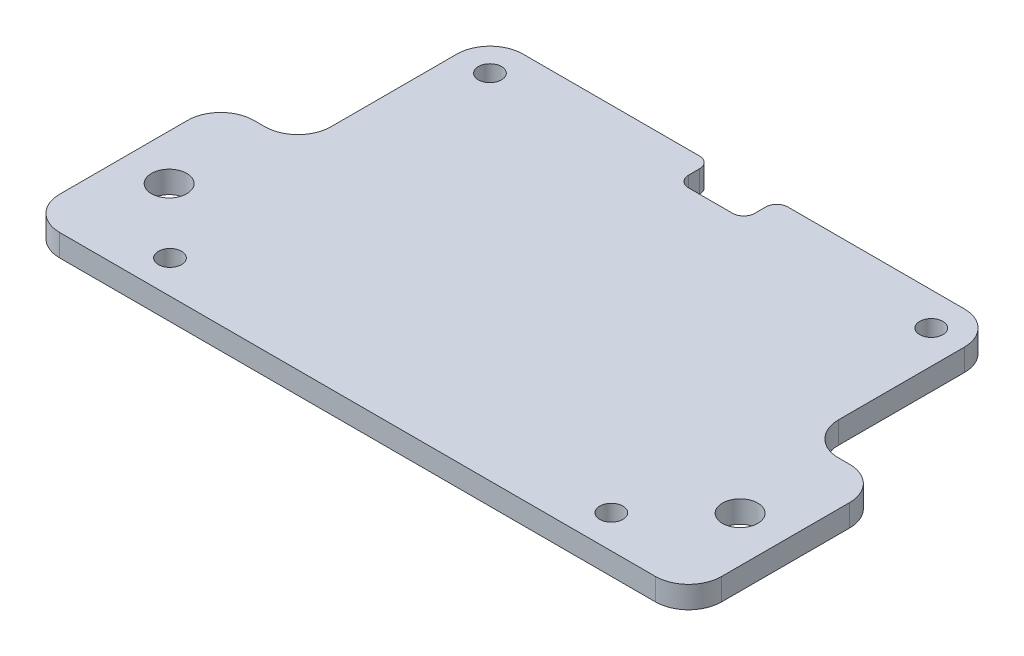
ISO-10303-21;
HEADER;
FILE_DESCRIPTION(('STEP AP214'),'2;1');
FILE_NAME('part.step','',(''),(''),'','','');
FILE_SCHEMA(('AUTOMOTIVE_DESIGN { 1 0 10303 214 1 1 1 1 }'));
ENDSEC;
DATA;
#1=APPLICATION_CONTEXT('core data for automotive mechanical design processes');
#2=APPLICATION_PROTOCOL_DEFINITION('international standard','automotive_design',2000,#1);
#3=PRODUCT_CONTEXT('',#1,'mechanical');
#4=PRODUCT('Part','Part','',(#3));
#5=PRODUCT_RELATED_PRODUCT_CATEGORY('part','',(#4));
#6=PRODUCT_DEFINITION_FORMATION('','',#4);
#7=PRODUCT_DEFINITION_CONTEXT('part definition',#1,'design');
#8=PRODUCT_DEFINITION('design','',#6,#7);
#9=PRODUCT_DEFINITION_SHAPE('','',#8);
#10=(LENGTH_UNIT() NAMED_UNIT(*) SI_UNIT(.MILLI.,.METRE.));
#11=(NAMED_UNIT(*) PLANE_ANGLE_UNIT() SI_UNIT($,.RADIAN.));
#12=(NAMED_UNIT(*) SI_UNIT($,.STERADIAN.) SOLID_ANGLE_UNIT());
#13=UNCERTAINTY_MEASURE_WITH_UNIT(LENGTH_MEASURE(1.E-05),#10,'distance_accuracy_value','');
#14=(GEOMETRIC_REPRESENTATION_CONTEXT(3) GLOBAL_UNCERTAINTY_ASSIGNED_CONTEXT((#13)) GLOBAL_UNIT_ASSIGNED_CONTEXT((#10,
#11,#12)) REPRESENTATION_CONTEXT('',''));
#15=CARTESIAN_POINT('',(0.,0.,0.));
#16=DIRECTION('',(0.,0.,1.));
#17=DIRECTION('',(1.,0.,0.));
#18=AXIS2_PLACEMENT_3D('',#15,#16,#17);
#19=CARTESIAN_POINT('',(-7.06061640884124,2.,-17.5));
#20=DIRECTION('',(0.,1.,0.));
#21=DIRECTION('',(0.,0.,1.));
#22=AXIS2_PLACEMENT_3D('',#19,#20,#21);
#23=PLANE('',#22);
#24=CARTESIAN_POINT('',(-50.0606164088412,2.,-14.5));
#25=DIRECTION('',(0.,1.,0.));
#26=DIRECTION('',(0.,0.,1.));
#27=AXIS2_PLACEMENT_3D('',#24,#25,#26);
#28=CIRCLE('',#27,1.05);
#29=CARTESIAN_POINT('',(-50.0606164088412,2.,-13.45));
#30=VERTEX_POINT('',#29);
#31=EDGE_CURVE('E518',#30,#30,#28,.T.);
#32=ORIENTED_EDGE('',*,*,#31,.F.);
#33=EDGE_LOOP('',(#32));
#34=FACE_BOUND('',#33,.T.);
#35=CARTESIAN_POINT('',(-55.9356164088412,2.,8.69999999999997));
#36=DIRECTION('',(0.,1.,0.));
#37=DIRECTION('',(0.,0.,1.));
#38=AXIS2_PLACEMENT_3D('',#35,#36,#37);
#39=CIRCLE('',#38,1.6);
#40=CARTESIAN_POINT('',(-55.9356164088412,2.,10.3));
#41=VERTEX_POINT('',#40);
#42=EDGE_CURVE('E506',#41,#41,#39,.T.);
#43=ORIENTED_EDGE('',*,*,#42,.F.);
#44=EDGE_LOOP('',(#43));
#45=FACE_BOUND('',#44,.T.);
#46=CARTESIAN_POINT('',(-10.0606164088412,2.,14.5));
#47=DIRECTION('',(0.,1.,0.));
#48=DIRECTION('',(0.,0.,1.));
#49=AXIS2_PLACEMENT_3D('',#46,#47,#48);
#50=CIRCLE('',#49,1.05);
#51=CARTESIAN_POINT('',(-10.0606164088412,2.,15.55));
#52=VERTEX_POINT('',#51);
#53=EDGE_CURVE('E376',#52,#52,#50,.T.);
#54=ORIENTED_EDGE('',*,*,#53,.F.);
#55=EDGE_LOOP('',(#54));
#56=FACE_BOUND('',#55,.T.);
#57=DIRECTION('',(0.,0.,-1.));
#58=VECTOR('',#57,1.);
#59=CARTESIAN_POINT('',(-33.0606164088412,2.,-14.5));
#60=LINE('',#59,#58);
#61=CARTESIAN_POINT('',(-33.0606164088412,2.,-15.5));
#62=VERTEX_POINT('',#61);
#63=CARTESIAN_POINT('',(-33.0606164088412,2.,-16.5));
#64=VERTEX_POINT('',#63);
#65=EDGE_CURVE('E347',#62,#64,#60,.T.);
#66=ORIENTED_EDGE('',*,*,#65,.T.);
#67=CARTESIAN_POINT('',(-34.0606164088412,2.,-16.5));
#68=DIRECTION('',(0.,1.,0.));
#69=DIRECTION('',(0.,0.,1.));
#70=AXIS2_PLACEMENT_3D('',#67,#68,#69);
#71=CIRCLE('',#70,1.);
#72=CARTESIAN_POINT('',(-34.0606164088412,2.,-17.5));
#73=VERTEX_POINT('',#72);
#74=EDGE_CURVE('E313',#64,#73,#71,.T.);
#75=ORIENTED_EDGE('',*,*,#74,.T.);
#76=DIRECTION('',(-1.,0.,0.));
#77=VECTOR('',#76,1.);
#78=CARTESIAN_POINT('',(-53.0606164088412,2.,-17.5));
#79=LINE('',#78,#77);
#80=CARTESIAN_POINT('',(-50.0606164088412,2.,-17.5));
#81=VERTEX_POINT('',#80);
#82=EDGE_CURVE('E351',#73,#81,#79,.T.);
#83=ORIENTED_EDGE('',*,*,#82,.T.);
#84=CARTESIAN_POINT('',(-50.0606164088412,2.,-14.5));
#85=DIRECTION('',(0.,1.,0.));
#86=DIRECTION('',(0.,0.,1.));
#87=AXIS2_PLACEMENT_3D('',#84,#85,#86);
#88=CIRCLE('',#87,3.);
#89=CARTESIAN_POINT('',(-53.0606164088412,2.,-14.5));
#90=VERTEX_POINT('',#89);
#91=EDGE_CURVE('E252',#81,#90,#88,.T.);
#92=ORIENTED_EDGE('',*,*,#91,.T.);
#93=DIRECTION('',(0.,0.,1.));
#94=VECTOR('',#93,1.);
#95=CARTESIAN_POINT('',(-53.0606164088412,2.,-0.100000000000037));
#96=LINE('',#95,#94);
#97=CARTESIAN_POINT('',(-53.0606164088412,2.,-3.10000000000004));
#98=VERTEX_POINT('',#97);
#99=EDGE_CURVE('E357',#90,#98,#96,.T.);
#100=ORIENTED_EDGE('',*,*,#99,.T.);
#101=CARTESIAN_POINT('',(-56.0606164088412,2.,-3.10000000000004));
#102=DIRECTION('',(0.,1.,0.));
#103=DIRECTION('',(0.,0.,1.));
#104=AXIS2_PLACEMENT_3D('',#101,#102,#103);
#105=CIRCLE('',#104,3.);
#106=CARTESIAN_POINT('',(-56.0606164088412,2.,-0.100000000000035));
#107=VERTEX_POINT('',#106);
#108=EDGE_CURVE('E293',#98,#107,#105,.F.);
#109=ORIENTED_EDGE('',*,*,#108,.T.);
#110=DIRECTION('',(-1.,0.,0.));
#111=VECTOR('',#110,1.);
#112=CARTESIAN_POINT('',(-53.0606164088412,2.,-0.100000000000037));
#113=LINE('',#112,#111);
#114=CARTESIAN_POINT('',(-57.0606164088412,2.,-0.100000000000034));
#115=VERTEX_POINT('',#114);
#116=EDGE_CURVE('E360',#107,#115,#113,.T.);
#117=ORIENTED_EDGE('',*,*,#116,.T.);
#118=CARTESIAN_POINT('',(-57.0606164088412,2.,2.89999999999997));
#119=DIRECTION('',(0.,1.,0.));
#120=DIRECTION('',(0.,0.,1.));
#121=AXIS2_PLACEMENT_3D('',#118,#119,#120);
#122=CIRCLE('',#121,3.);
#123=CARTESIAN_POINT('',(-60.0606164088412,2.,2.89999999999997));
#124=VERTEX_POINT('',#123);
#125=EDGE_CURVE('E250',#115,#124,#122,.T.);
#126=ORIENTED_EDGE('',*,*,#125,.T.);
#127=DIRECTION('',(0.,0.,1.));
#128=VECTOR('',#127,1.);
#129=CARTESIAN_POINT('',(-60.0606164088412,2.,17.5));
#130=LINE('',#129,#128);
#131=CARTESIAN_POINT('',(-60.0606164088412,2.,14.5));
#132=VERTEX_POINT('',#131);
#133=EDGE_CURVE('E363',#124,#132,#130,.T.);
#134=ORIENTED_EDGE('',*,*,#133,.T.);
#135=CARTESIAN_POINT('',(-57.0606164088412,2.,14.5));
#136=DIRECTION('',(0.,1.,0.));
#137=DIRECTION('',(0.,0.,1.));
#138=AXIS2_PLACEMENT_3D('',#135,#136,#137);
#139=CIRCLE('',#138,3.);
#140=CARTESIAN_POINT('',(-57.0606164088412,2.,17.5));
#141=VERTEX_POINT('',#140);
#142=EDGE_CURVE('E248',#132,#141,#139,.T.);
#143=ORIENTED_EDGE('',*,*,#142,.T.);
#144=DIRECTION('',(1.,0.,0.));
#145=VECTOR('',#144,1.);
#146=CARTESIAN_POINT('',(-30.0606164088412,2.,17.5));
#147=LINE('',#146,#145);
#148=CARTESIAN_POINT('',(-3.06061640884124,2.,17.5));
#149=VERTEX_POINT('',#148);
#150=EDGE_CURVE('E366',#141,#149,#147,.T.);
#151=ORIENTED_EDGE('',*,*,#150,.T.);
#152=CARTESIAN_POINT('',(-3.06061640884124,2.,14.5));
#153=DIRECTION('',(0.,1.,0.));
#154=DIRECTION('',(0.,0.,1.));
#155=AXIS2_PLACEMENT_3D('',#152,#153,#154);
#156=CIRCLE('',#155,3.);
#157=CARTESIAN_POINT('',(-0.0606164088412381,2.,14.5));
#158=VERTEX_POINT('',#157);
#159=EDGE_CURVE('E258',#149,#158,#156,.T.);
#160=ORIENTED_EDGE('',*,*,#159,.T.);
#161=DIRECTION('',(0.,0.,-1.));
#162=VECTOR('',#161,1.);
#163=CARTESIAN_POINT('',(-0.0606164088412381,2.,17.5));
#164=LINE('',#163,#162);
#165=CARTESIAN_POINT('',(-0.0606164088412381,2.,2.89999999999997));
#166=VERTEX_POINT('',#165);
#167=EDGE_CURVE('E213',#158,#166,#164,.T.);
#168=ORIENTED_EDGE('',*,*,#167,.T.);
#169=CARTESIAN_POINT('',(-3.06061640884124,2.,2.89999999999996));
#170=DIRECTION('',(0.,1.,0.));
#171=DIRECTION('',(0.,0.,1.));
#172=AXIS2_PLACEMENT_3D('',#169,#170,#171);
#173=CIRCLE('',#172,3.);
#174=CARTESIAN_POINT('',(-3.06061640884124,2.,-0.100000000000035));
#175=VERTEX_POINT('',#174);
#176=EDGE_CURVE('E256',#166,#175,#173,.T.);
#177=ORIENTED_EDGE('',*,*,#176,.T.);
#178=DIRECTION('',(-1.,0.,0.));
#179=VECTOR('',#178,1.);
#180=CARTESIAN_POINT('',(-7.06061640884124,2.,-0.100000000000037));
#181=LINE('',#180,#179);
#182=CARTESIAN_POINT('',(-4.06061640884124,2.,-0.100000000000036));
#183=VERTEX_POINT('',#182);
#184=EDGE_CURVE('E370',#175,#183,#181,.T.);
#185=ORIENTED_EDGE('',*,*,#184,.T.);
#186=CARTESIAN_POINT('',(-4.06061640884124,2.,-3.10000000000004));
#187=DIRECTION('',(0.,1.,0.));
#188=DIRECTION('',(0.,0.,1.));
#189=AXIS2_PLACEMENT_3D('',#186,#187,#188);
#190=CIRCLE('',#189,3.);
#191=CARTESIAN_POINT('',(-7.06061640884124,2.,-3.10000000000004));
#192=VERTEX_POINT('',#191);
#193=EDGE_CURVE('E297',#183,#192,#190,.F.);
#194=ORIENTED_EDGE('',*,*,#193,.T.);
#195=DIRECTION('',(0.,0.,-1.));
#196=VECTOR('',#195,1.);
#197=CARTESIAN_POINT('',(-7.06061640884124,2.,-0.100000000000037));
#198=LINE('',#197,#196);
#199=CARTESIAN_POINT('',(-7.06061640884124,2.,-14.5));
#200=VERTEX_POINT('',#199);
#201=EDGE_CURVE('E234',#192,#200,#198,.T.);
#202=ORIENTED_EDGE('',*,*,#201,.T.);
#203=CARTESIAN_POINT('',(-10.0606164088412,2.,-14.5));
#204=DIRECTION('',(0.,1.,0.));
#205=DIRECTION('',(0.,0.,1.));
#206=AXIS2_PLACEMENT_3D('',#203,#204,#205);
#207=CIRCLE('',#206,3.);
#208=CARTESIAN_POINT('',(-10.0606164088412,2.,-17.5));
#209=VERTEX_POINT('',#208);
#210=EDGE_CURVE('E254',#200,#209,#207,.T.);
#211=ORIENTED_EDGE('',*,*,#210,.T.);
#212=DIRECTION('',(-1.,0.,0.));
#213=VECTOR('',#212,1.);
#214=CARTESIAN_POINT('',(-27.0606164088412,2.,-17.5));
#215=LINE('',#214,#213);
#216=CARTESIAN_POINT('',(-26.0606164088412,2.,-17.5));
#217=VERTEX_POINT('',#216);
#218=EDGE_CURVE('E233',#209,#217,#215,.T.);
#219=ORIENTED_EDGE('',*,*,#218,.T.);
#220=CARTESIAN_POINT('',(-26.0606164088412,2.,-16.5));
#221=DIRECTION('',(0.,1.,0.));
#222=DIRECTION('',(0.,0.,1.));
#223=AXIS2_PLACEMENT_3D('',#220,#221,#222);
#224=CIRCLE('',#223,1.);
#225=CARTESIAN_POINT('',(-27.0606164088412,2.,-16.5));
#226=VERTEX_POINT('',#225);
#227=EDGE_CURVE('E311',#217,#226,#224,.T.);
#228=ORIENTED_EDGE('',*,*,#227,.T.);
#229=DIRECTION('',(0.,0.,1.));
#230=VECTOR('',#229,1.);
#231=CARTESIAN_POINT('',(-27.0606164088412,2.,-17.5));
#232=LINE('',#231,#230);
#233=CARTESIAN_POINT('',(-27.0606164088412,2.,-15.5));
#234=VERTEX_POINT('',#233);
#235=EDGE_CURVE('E348',#226,#234,#232,.T.);
#236=ORIENTED_EDGE('',*,*,#235,.T.);
#237=CARTESIAN_POINT('',(-28.0606164088412,2.,-15.5));
#238=DIRECTION('',(0.,1.,0.));
#239=DIRECTION('',(0.,0.,1.));
#240=AXIS2_PLACEMENT_3D('',#237,#238,#239);
#241=CIRCLE('',#240,1.);
#242=CARTESIAN_POINT('',(-28.0606164088412,2.,-14.5));
#243=VERTEX_POINT('',#242);
#244=EDGE_CURVE('E11',#234,#243,#241,.F.);
#245=ORIENTED_EDGE('',*,*,#244,.T.);
#246=DIRECTION('',(-1.,0.,0.));
#247=VECTOR('',#246,1.);
#248=CARTESIAN_POINT('',(-27.0606164088412,2.,-14.5));
#249=LINE('',#248,#247);
#250=CARTESIAN_POINT('',(-32.0606164088412,2.,-14.5));
#251=VERTEX_POINT('',#250);
#252=EDGE_CURVE('E345',#243,#251,#249,.T.);
#253=ORIENTED_EDGE('',*,*,#252,.T.);
#254=CARTESIAN_POINT('',(-32.0606164088412,2.,-15.5));
#255=DIRECTION('',(0.,1.,0.));
#256=DIRECTION('',(0.,0.,1.));
#257=AXIS2_PLACEMENT_3D('',#254,#255,#256);
#258=CIRCLE('',#257,1.);
#259=EDGE_CURVE('E328',#251,#62,#258,.F.);
#260=ORIENTED_EDGE('',*,*,#259,.T.);
#261=EDGE_LOOP('',(#66,#75,#83,#92,#100,#109,#117,#126,#134,#143,#151,#160,#168,#177,#185,#194,
#202,#211,#219,#228,#236,#245,#253,#260));
#262=FACE_BOUND('',#261,.T.);
#263=CARTESIAN_POINT('',(-4.18561640884124,2.,8.69999999999997));
#264=DIRECTION('',(0.,1.,0.));
#265=DIRECTION('',(0.,0.,1.));
#266=AXIS2_PLACEMENT_3D('',#263,#264,#265);
#267=CIRCLE('',#266,1.6);
#268=CARTESIAN_POINT('',(-4.18561640884124,2.,10.3));
#269=VERTEX_POINT('',#268);
#270=EDGE_CURVE('E500',#269,#269,#267,.T.);
#271=ORIENTED_EDGE('',*,*,#270,.F.);
#272=EDGE_LOOP('',(#271));
#273=FACE_BOUND('',#272,.T.);
#274=CARTESIAN_POINT('',(-50.0606164088412,2.,14.5));
#275=DIRECTION('',(0.,1.,0.));
#276=DIRECTION('',(0.,0.,1.));
#277=AXIS2_PLACEMENT_3D('',#274,#275,#276);
#278=CIRCLE('',#277,1.05);
#279=CARTESIAN_POINT('',(-50.0606164088412,2.,15.55));
#280=VERTEX_POINT('',#279);
#281=EDGE_CURVE('E512',#280,#280,#278,.T.);
#282=ORIENTED_EDGE('',*,*,#281,.F.);
#283=EDGE_LOOP('',(#282));
#284=FACE_BOUND('',#283,.T.);
#285=CARTESIAN_POINT('',(-10.0606164088412,2.,-14.5));
#286=DIRECTION('',(0.,1.,0.));
#287=DIRECTION('',(0.,0.,1.));
#288=AXIS2_PLACEMENT_3D('',#285,#286,#287);
#289=CIRCLE('',#288,1.05);
#290=CARTESIAN_POINT('',(-10.0606164088412,2.,-13.45));
#291=VERTEX_POINT('',#290);
#292=EDGE_CURVE('E524',#291,#291,#289,.T.);
#293=ORIENTED_EDGE('',*,*,#292,.F.);
#294=EDGE_LOOP('',(#293));
#295=FACE_BOUND('',#294,.T.);
#296=ADVANCED_FACE('F32',(#34,#45,#56,#262,#273,#284,#295),#23,.T.);
#297=CARTESIAN_POINT('',(-7.06061640884124,0.,-17.5));
#298=DIRECTION('',(0.,1.,0.));
#299=DIRECTION('',(0.,0.,1.));
#300=AXIS2_PLACEMENT_3D('',#297,#298,#299);
#301=PLANE('',#300);
#302=CARTESIAN_POINT('',(-50.0606164088412,0.,-14.5));
#303=DIRECTION('',(0.,1.,0.));
#304=DIRECTION('',(0.,0.,1.));
#305=AXIS2_PLACEMENT_3D('',#302,#303,#304);
#306=CIRCLE('',#305,1.05);
#307=CARTESIAN_POINT('',(-50.0606164088412,0.,-13.45));
#308=VERTEX_POINT('',#307);
#309=EDGE_CURVE('E521',#308,#308,#306,.T.);
#310=ORIENTED_EDGE('',*,*,#309,.T.);
#311=EDGE_LOOP('',(#310));
#312=FACE_BOUND('',#311,.T.);
#313=CARTESIAN_POINT('',(-55.9356164088412,0.,8.69999999999997));
#314=DIRECTION('',(0.,1.,0.));
#315=DIRECTION('',(0.,0.,1.));
#316=AXIS2_PLACEMENT_3D('',#313,#314,#315);
#317=CIRCLE('',#316,1.6);
#318=CARTESIAN_POINT('',(-55.9356164088412,0.,10.3));
#319=VERTEX_POINT('',#318);
#320=EDGE_CURVE('E509',#319,#319,#317,.T.);
#321=ORIENTED_EDGE('',*,*,#320,.T.);
#322=EDGE_LOOP('',(#321));
#323=FACE_BOUND('',#322,.T.);
#324=CARTESIAN_POINT('',(-10.0606164088412,0.,14.5));
#325=DIRECTION('',(0.,1.,0.));
#326=DIRECTION('',(0.,0.,1.));
#327=AXIS2_PLACEMENT_3D('',#324,#325,#326);
#328=CIRCLE('',#327,1.05);
#329=CARTESIAN_POINT('',(-10.0606164088412,0.,15.55));
#330=VERTEX_POINT('',#329);
#331=EDGE_CURVE('E497',#330,#330,#328,.T.);
#332=ORIENTED_EDGE('',*,*,#331,.T.);
#333=EDGE_LOOP('',(#332));
#334=FACE_BOUND('',#333,.T.);
#335=DIRECTION('',(-1.,0.,0.));
#336=VECTOR('',#335,1.);
#337=CARTESIAN_POINT('',(-53.0606164088412,0.,-17.5));
#338=LINE('',#337,#336);
#339=CARTESIAN_POINT('',(-34.0606164088412,0.,-17.5));
#340=VERTEX_POINT('',#339);
#341=CARTESIAN_POINT('',(-50.0606164088412,0.,-17.5));
#342=VERTEX_POINT('',#341);
#343=EDGE_CURVE('E382',#340,#342,#338,.T.);
#344=ORIENTED_EDGE('',*,*,#343,.F.);
#345=CARTESIAN_POINT('',(-34.0606164088412,0.,-16.5));
#346=DIRECTION('',(0.,1.,0.));
#347=DIRECTION('',(0.,0.,1.));
#348=AXIS2_PLACEMENT_3D('',#345,#346,#347);
#349=CIRCLE('',#348,1.);
#350=CARTESIAN_POINT('',(-33.0606164088412,0.,-16.5));
#351=VERTEX_POINT('',#350);
#352=EDGE_CURVE('E304',#340,#351,#349,.F.);
#353=ORIENTED_EDGE('',*,*,#352,.T.);
#354=DIRECTION('',(0.,0.,-1.));
#355=VECTOR('',#354,1.);
#356=CARTESIAN_POINT('',(-33.0606164088412,0.,-14.5));
#357=LINE('',#356,#355);
#358=CARTESIAN_POINT('',(-33.0606164088412,0.,-15.5));
#359=VERTEX_POINT('',#358);
#360=EDGE_CURVE('E379',#359,#351,#357,.T.);
#361=ORIENTED_EDGE('',*,*,#360,.F.);
#362=CARTESIAN_POINT('',(-32.0606164088412,0.,-15.5));
#363=DIRECTION('',(0.,1.,0.));
#364=DIRECTION('',(0.,0.,1.));
#365=AXIS2_PLACEMENT_3D('',#362,#363,#364);
#366=CIRCLE('',#365,1.);
#367=CARTESIAN_POINT('',(-32.0606164088412,0.,-14.5));
#368=VERTEX_POINT('',#367);
#369=EDGE_CURVE('E326',#359,#368,#366,.T.);
#370=ORIENTED_EDGE('',*,*,#369,.T.);
#371=DIRECTION('',(-1.,0.,0.));
#372=VECTOR('',#371,1.);
#373=CARTESIAN_POINT('',(-27.0606164088412,0.,-14.5));
#374=LINE('',#373,#372);
#375=CARTESIAN_POINT('',(-28.0606164088412,0.,-14.5));
#376=VERTEX_POINT('',#375);
#377=EDGE_CURVE('E333',#376,#368,#374,.T.);
#378=ORIENTED_EDGE('',*,*,#377,.F.);
#379=CARTESIAN_POINT('',(-28.0606164088412,0.,-15.5));
#380=DIRECTION('',(0.,1.,0.));
#381=DIRECTION('',(0.,0.,1.));
#382=AXIS2_PLACEMENT_3D('',#379,#380,#381);
#383=CIRCLE('',#382,1.);
#384=CARTESIAN_POINT('',(-27.0606164088412,0.,-15.5));
#385=VERTEX_POINT('',#384);
#386=EDGE_CURVE('E40',#376,#385,#383,.T.);
#387=ORIENTED_EDGE('',*,*,#386,.T.);
#388=DIRECTION('',(0.,0.,1.));
#389=VECTOR('',#388,1.);
#390=CARTESIAN_POINT('',(-27.0606164088412,0.,-17.5));
#391=LINE('',#390,#389);
#392=CARTESIAN_POINT('',(-27.0606164088412,0.,-16.5));
#393=VERTEX_POINT('',#392);
#394=EDGE_CURVE('E332',#393,#385,#391,.T.);
#395=ORIENTED_EDGE('',*,*,#394,.F.);
#396=CARTESIAN_POINT('',(-26.0606164088412,0.,-16.5));
#397=DIRECTION('',(0.,1.,0.));
#398=DIRECTION('',(0.,0.,1.));
#399=AXIS2_PLACEMENT_3D('',#396,#397,#398);
#400=CIRCLE('',#399,1.);
#401=CARTESIAN_POINT('',(-26.0606164088412,0.,-17.5));
#402=VERTEX_POINT('',#401);
#403=EDGE_CURVE('E302',#393,#402,#400,.F.);
#404=ORIENTED_EDGE('',*,*,#403,.T.);
#405=DIRECTION('',(-1.,0.,0.));
#406=VECTOR('',#405,1.);
#407=CARTESIAN_POINT('',(-27.0606164088412,0.,-17.5));
#408=LINE('',#407,#406);
#409=CARTESIAN_POINT('',(-10.0606164088412,0.,-17.5));
#410=VERTEX_POINT('',#409);
#411=EDGE_CURVE('E341',#410,#402,#408,.T.);
#412=ORIENTED_EDGE('',*,*,#411,.F.);
#413=CARTESIAN_POINT('',(-10.0606164088412,0.,-14.5));
#414=DIRECTION('',(0.,1.,0.));
#415=DIRECTION('',(0.,0.,1.));
#416=AXIS2_PLACEMENT_3D('',#413,#414,#415);
#417=CIRCLE('',#416,3.);
#418=CARTESIAN_POINT('',(-7.06061640884124,0.,-14.5));
#419=VERTEX_POINT('',#418);
#420=EDGE_CURVE('E242',#410,#419,#417,.F.);
#421=ORIENTED_EDGE('',*,*,#420,.T.);
#422=DIRECTION('',(0.,0.,-1.));
#423=VECTOR('',#422,1.);
#424=CARTESIAN_POINT('',(-7.06061640884124,0.,-0.100000000000037));
#425=LINE('',#424,#423);
#426=CARTESIAN_POINT('',(-7.06061640884124,0.,-3.10000000000004));
#427=VERTEX_POINT('',#426);
#428=EDGE_CURVE('E225',#427,#419,#425,.T.);
#429=ORIENTED_EDGE('',*,*,#428,.F.);
#430=CARTESIAN_POINT('',(-4.06061640884124,0.,-3.10000000000004));
#431=DIRECTION('',(0.,1.,0.));
#432=DIRECTION('',(0.,0.,1.));
#433=AXIS2_PLACEMENT_3D('',#430,#431,#432);
#434=CIRCLE('',#433,3.);
#435=CARTESIAN_POINT('',(-4.06061640884124,0.,-0.100000000000036));
#436=VERTEX_POINT('',#435);
#437=EDGE_CURVE('E295',#427,#436,#434,.T.);
#438=ORIENTED_EDGE('',*,*,#437,.T.);
#439=DIRECTION('',(-1.,0.,0.));
#440=VECTOR('',#439,1.);
#441=CARTESIAN_POINT('',(-7.06061640884124,0.,-0.100000000000037));
#442=LINE('',#441,#440);
#443=CARTESIAN_POINT('',(-3.06061640884124,0.,-0.100000000000035));
#444=VERTEX_POINT('',#443);
#445=EDGE_CURVE('E221',#444,#436,#442,.T.);
#446=ORIENTED_EDGE('',*,*,#445,.F.);
#447=CARTESIAN_POINT('',(-3.06061640884124,0.,2.89999999999996));
#448=DIRECTION('',(0.,1.,0.));
#449=DIRECTION('',(0.,0.,1.));
#450=AXIS2_PLACEMENT_3D('',#447,#448,#449);
#451=CIRCLE('',#450,3.);
#452=CARTESIAN_POINT('',(-0.0606164088412381,0.,2.89999999999997));
#453=VERTEX_POINT('',#452);
#454=EDGE_CURVE('E204',#444,#453,#451,.F.);
#455=ORIENTED_EDGE('',*,*,#454,.T.);
#456=DIRECTION('',(0.,0.,-1.));
#457=VECTOR('',#456,1.);
#458=CARTESIAN_POINT('',(-0.0606164088412381,0.,17.5));
#459=LINE('',#458,#457);
#460=CARTESIAN_POINT('',(-0.0606164088412381,0.,14.5));
#461=VERTEX_POINT('',#460);
#462=EDGE_CURVE('E210',#461,#453,#459,.T.);
#463=ORIENTED_EDGE('',*,*,#462,.F.);
#464=CARTESIAN_POINT('',(-3.06061640884124,0.,14.5));
#465=DIRECTION('',(0.,1.,0.));
#466=DIRECTION('',(0.,0.,1.));
#467=AXIS2_PLACEMENT_3D('',#464,#465,#466);
#468=CIRCLE('',#467,3.);
#469=CARTESIAN_POINT('',(-3.06061640884124,0.,17.5));
#470=VERTEX_POINT('',#469);
#471=EDGE_CURVE('E193',#461,#470,#468,.F.);
#472=ORIENTED_EDGE('',*,*,#471,.T.);
#473=DIRECTION('',(1.,0.,0.));
#474=VECTOR('',#473,1.);
#475=CARTESIAN_POINT('',(-0.0606164088412381,0.,17.5));
#476=LINE('',#475,#474);
#477=CARTESIAN_POINT('',(-57.0606164088412,0.,17.5));
#478=VERTEX_POINT('',#477);
#479=EDGE_CURVE('E222',#478,#470,#476,.T.);
#480=ORIENTED_EDGE('',*,*,#479,.F.);
#481=CARTESIAN_POINT('',(-57.0606164088412,0.,14.5));
#482=DIRECTION('',(0.,1.,0.));
#483=DIRECTION('',(0.,0.,1.));
#484=AXIS2_PLACEMENT_3D('',#481,#482,#483);
#485=CIRCLE('',#484,3.);
#486=CARTESIAN_POINT('',(-60.0606164088412,0.,14.5));
#487=VERTEX_POINT('',#486);
#488=EDGE_CURVE('E214',#478,#487,#485,.F.);
#489=ORIENTED_EDGE('',*,*,#488,.T.);
#490=DIRECTION('',(0.,0.,1.));
#491=VECTOR('',#490,1.);
#492=CARTESIAN_POINT('',(-60.0606164088412,0.,17.5));
#493=LINE('',#492,#491);
#494=CARTESIAN_POINT('',(-60.0606164088412,0.,2.89999999999997));
#495=VERTEX_POINT('',#494);
#496=EDGE_CURVE('E227',#495,#487,#493,.T.);
#497=ORIENTED_EDGE('',*,*,#496,.F.);
#498=CARTESIAN_POINT('',(-57.0606164088412,0.,2.89999999999997));
#499=DIRECTION('',(0.,1.,0.));
#500=DIRECTION('',(0.,0.,1.));
#501=AXIS2_PLACEMENT_3D('',#498,#499,#500);
#502=CIRCLE('',#501,3.);
#503=CARTESIAN_POINT('',(-57.0606164088412,0.,-0.100000000000034));
#504=VERTEX_POINT('',#503);
#505=EDGE_CURVE('E237',#495,#504,#502,.F.);
#506=ORIENTED_EDGE('',*,*,#505,.T.);
#507=DIRECTION('',(-1.,0.,0.));
#508=VECTOR('',#507,1.);
#509=CARTESIAN_POINT('',(-53.0606164088412,0.,-0.100000000000037));
#510=LINE('',#509,#508);
#511=CARTESIAN_POINT('',(-56.0606164088412,0.,-0.100000000000035));
#512=VERTEX_POINT('',#511);
#513=EDGE_CURVE('E387',#512,#504,#510,.T.);
#514=ORIENTED_EDGE('',*,*,#513,.F.);
#515=CARTESIAN_POINT('',(-56.0606164088412,0.,-3.10000000000004));
#516=DIRECTION('',(0.,1.,0.));
#517=DIRECTION('',(0.,0.,1.));
#518=AXIS2_PLACEMENT_3D('',#515,#516,#517);
#519=CIRCLE('',#518,3.);
#520=CARTESIAN_POINT('',(-53.0606164088412,0.,-3.10000000000004));
#521=VERTEX_POINT('',#520);
#522=EDGE_CURVE('E291',#512,#521,#519,.T.);
#523=ORIENTED_EDGE('',*,*,#522,.T.);
#524=DIRECTION('',(0.,0.,1.));
#525=VECTOR('',#524,1.);
#526=CARTESIAN_POINT('',(-53.0606164088412,0.,-0.100000000000037));
#527=LINE('',#526,#525);
#528=CARTESIAN_POINT('',(-53.0606164088412,0.,-14.5));
#529=VERTEX_POINT('',#528);
#530=EDGE_CURVE('E384',#529,#521,#527,.T.);
#531=ORIENTED_EDGE('',*,*,#530,.F.);
#532=CARTESIAN_POINT('',(-50.0606164088412,0.,-14.5));
#533=DIRECTION('',(0.,1.,0.));
#534=DIRECTION('',(0.,0.,1.));
#535=AXIS2_PLACEMENT_3D('',#532,#533,#534);
#536=CIRCLE('',#535,3.);
#537=EDGE_CURVE('E239',#529,#342,#536,.F.);
#538=ORIENTED_EDGE('',*,*,#537,.T.);
#539=EDGE_LOOP('',(#344,#353,#361,#370,#378,#387,#395,#404,#412,#421,#429,#438,#446,#455,#463,
#472,#480,#489,#497,#506,#514,#523,#531,#538));
#540=FACE_BOUND('',#539,.T.);
#541=CARTESIAN_POINT('',(-4.18561640884124,0.,8.69999999999997));
#542=DIRECTION('',(0.,1.,0.));
#543=DIRECTION('',(0.,0.,1.));
#544=AXIS2_PLACEMENT_3D('',#541,#542,#543);
#545=CIRCLE('',#544,1.6);
#546=CARTESIAN_POINT('',(-4.18561640884124,0.,10.3));
#547=VERTEX_POINT('',#546);
#548=EDGE_CURVE('E503',#547,#547,#545,.T.);
#549=ORIENTED_EDGE('',*,*,#548,.T.);
#550=EDGE_LOOP('',(#549));
#551=FACE_BOUND('',#550,.T.);
#552=CARTESIAN_POINT('',(-50.0606164088412,0.,14.5));
#553=DIRECTION('',(0.,1.,0.));
#554=DIRECTION('',(0.,0.,1.));
#555=AXIS2_PLACEMENT_3D('',#552,#553,#554);
#556=CIRCLE('',#555,1.05);
#557=CARTESIAN_POINT('',(-50.0606164088412,0.,15.55));
#558=VERTEX_POINT('',#557);
#559=EDGE_CURVE('E515',#558,#558,#556,.T.);
#560=ORIENTED_EDGE('',*,*,#559,.T.);
#561=EDGE_LOOP('',(#560));
#562=FACE_BOUND('',#561,.T.);
#563=CARTESIAN_POINT('',(-10.0606164088412,0.,-14.5));
#564=DIRECTION('',(0.,1.,0.));
#565=DIRECTION('',(0.,0.,1.));
#566=AXIS2_PLACEMENT_3D('',#563,#564,#565);
#567=CIRCLE('',#566,1.05);
#568=CARTESIAN_POINT('',(-10.0606164088412,0.,-13.45));
#569=VERTEX_POINT('',#568);
#570=EDGE_CURVE('E527',#569,#569,#567,.T.);
#571=ORIENTED_EDGE('',*,*,#570,.T.);
#572=EDGE_LOOP('',(#571));
#573=FACE_BOUND('',#572,.T.);
#574=ADVANCED_FACE('F218',(#312,#323,#334,#540,#551,#562,#573),#301,.F.);
#575=CARTESIAN_POINT('',(-27.0606164088412,2.,-17.5));
#576=DIRECTION('',(0.,0.,1.));
#577=DIRECTION('',(1.,0.,0.));
#578=AXIS2_PLACEMENT_3D('',#575,#576,#577);
#579=PLANE('',#578);
#580=ORIENTED_EDGE('',*,*,#411,.T.);
#581=DIRECTION('',(0.,-1.,0.));
#582=VECTOR('',#581,1.);
#583=CARTESIAN_POINT('',(-26.0606164088412,2.,-17.5));
#584=LINE('',#583,#582);
#585=EDGE_CURVE('E324',#402,#217,#584,.F.);
#586=ORIENTED_EDGE('',*,*,#585,.T.);
#587=ORIENTED_EDGE('',*,*,#218,.F.);
#588=DIRECTION('',(0.,-1.,0.));
#589=VECTOR('',#588,1.);
#590=CARTESIAN_POINT('',(-10.0606164088412,2.,-17.5));
#591=LINE('',#590,#589);
#592=EDGE_CURVE('E280',#209,#410,#591,.T.);
#593=ORIENTED_EDGE('',*,*,#592,.T.);
#594=EDGE_LOOP('',(#580,#586,#587,#593));
#595=FACE_BOUND('',#594,.T.);
#596=ADVANCED_FACE('F420',(#595),#579,.F.);
#597=CARTESIAN_POINT('',(-27.0606164088412,2.,-17.5));
#598=DIRECTION('',(1.,0.,0.));
#599=DIRECTION('',(0.,0.,-1.));
#600=AXIS2_PLACEMENT_3D('',#597,#598,#599);
#601=PLANE('',#600);
#602=ORIENTED_EDGE('',*,*,#394,.T.);
#603=DIRECTION('',(0.,-1.,0.));
#604=VECTOR('',#603,1.);
#605=CARTESIAN_POINT('',(-27.0606164088412,2.,-15.5));
#606=LINE('',#605,#604);
#607=EDGE_CURVE('E322',#385,#234,#606,.F.);
#608=ORIENTED_EDGE('',*,*,#607,.T.);
#609=ORIENTED_EDGE('',*,*,#235,.F.);
#610=DIRECTION('',(0.,-1.,0.));
#611=VECTOR('',#610,1.);
#612=CARTESIAN_POINT('',(-27.0606164088412,2.,-16.5));
#613=LINE('',#612,#611);
#614=EDGE_CURVE('E319',#226,#393,#613,.T.);
#615=ORIENTED_EDGE('',*,*,#614,.T.);
#616=EDGE_LOOP('',(#602,#608,#609,#615));
#617=FACE_BOUND('',#616,.T.);
#618=ADVANCED_FACE('F338',(#617),#601,.F.);
#619=CARTESIAN_POINT('',(-27.0606164088412,2.,-14.5));
#620=DIRECTION('',(0.,0.,1.));
#621=DIRECTION('',(1.,0.,0.));
#622=AXIS2_PLACEMENT_3D('',#619,#620,#621);
#623=PLANE('',#622);
#624=ORIENTED_EDGE('',*,*,#377,.T.);
#625=DIRECTION('',(0.,-1.,0.));
#626=VECTOR('',#625,1.);
#627=CARTESIAN_POINT('',(-32.0606164088412,2.,-14.5));
#628=LINE('',#627,#626);
#629=EDGE_CURVE('E47',#368,#251,#628,.F.);
#630=ORIENTED_EDGE('',*,*,#629,.T.);
#631=ORIENTED_EDGE('',*,*,#252,.F.);
#632=DIRECTION('',(0.,-1.,0.));
#633=VECTOR('',#632,1.);
#634=CARTESIAN_POINT('',(-28.0606164088412,0.,-14.5));
#635=LINE('',#634,#633);
#636=EDGE_CURVE('E315',#243,#376,#635,.T.);
#637=ORIENTED_EDGE('',*,*,#636,.T.);
#638=EDGE_LOOP('',(#624,#630,#631,#637));
#639=FACE_BOUND('',#638,.T.);
#640=ADVANCED_FACE('F344',(#639),#623,.F.);
#641=CARTESIAN_POINT('',(-33.0606164088412,2.,-14.5));
#642=DIRECTION('',(-1.,0.,0.));
#643=DIRECTION('',(0.,0.,1.));
#644=AXIS2_PLACEMENT_3D('',#641,#642,#643);
#645=PLANE('',#644);
#646=ORIENTED_EDGE('',*,*,#360,.T.);
#647=DIRECTION('',(0.,-1.,0.));
#648=VECTOR('',#647,1.);
#649=CARTESIAN_POINT('',(-33.0606164088412,2.,-16.5));
#650=LINE('',#649,#648);
#651=EDGE_CURVE('E309',#351,#64,#650,.F.);
#652=ORIENTED_EDGE('',*,*,#651,.T.);
#653=ORIENTED_EDGE('',*,*,#65,.F.);
#654=DIRECTION('',(0.,-1.,0.));
#655=VECTOR('',#654,1.);
#656=CARTESIAN_POINT('',(-33.0606164088412,0.,-15.5));
#657=LINE('',#656,#655);
#658=EDGE_CURVE('E306',#62,#359,#657,.T.);
#659=ORIENTED_EDGE('',*,*,#658,.T.);
#660=EDGE_LOOP('',(#646,#652,#653,#659));
#661=FACE_BOUND('',#660,.T.);
#662=ADVANCED_FACE('F664',(#661),#645,.F.);
#663=CARTESIAN_POINT('',(-53.0606164088412,2.,-17.5));
#664=DIRECTION('',(0.,0.,1.));
#665=DIRECTION('',(1.,0.,0.));
#666=AXIS2_PLACEMENT_3D('',#663,#664,#665);
#667=PLANE('',#666);
#668=ORIENTED_EDGE('',*,*,#82,.F.);
#669=DIRECTION('',(0.,-1.,0.));
#670=VECTOR('',#669,1.);
#671=CARTESIAN_POINT('',(-34.0606164088412,2.,-17.5));
#672=LINE('',#671,#670);
#673=EDGE_CURVE('E299',#73,#340,#672,.T.);
#674=ORIENTED_EDGE('',*,*,#673,.T.);
#675=ORIENTED_EDGE('',*,*,#343,.T.);
#676=DIRECTION('',(0.,-1.,0.));
#677=VECTOR('',#676,1.);
#678=CARTESIAN_POINT('',(-50.0606164088412,2.,-17.5));
#679=LINE('',#678,#677);
#680=EDGE_CURVE('E283',#342,#81,#679,.F.);
#681=ORIENTED_EDGE('',*,*,#680,.T.);
#682=EDGE_LOOP('',(#668,#674,#675,#681));
#683=FACE_BOUND('',#682,.T.);
#684=ADVANCED_FACE('F673',(#683),#667,.F.);
#685=CARTESIAN_POINT('',(-53.0606164088412,2.,-0.100000000000037));
#686=DIRECTION('',(1.,0.,0.));
#687=DIRECTION('',(0.,0.,-1.));
#688=AXIS2_PLACEMENT_3D('',#685,#686,#687);
#689=PLANE('',#688);
#690=ORIENTED_EDGE('',*,*,#530,.T.);
#691=DIRECTION('',(0.,-1.,0.));
#692=VECTOR('',#691,1.);
#693=CARTESIAN_POINT('',(-53.0606164088412,2.,-3.10000000000004));
#694=LINE('',#693,#692);
#695=EDGE_CURVE('E273',#521,#98,#694,.F.);
#696=ORIENTED_EDGE('',*,*,#695,.T.);
#697=ORIENTED_EDGE('',*,*,#99,.F.);
#698=DIRECTION('',(0.,-1.,0.));
#699=VECTOR('',#698,1.);
#700=CARTESIAN_POINT('',(-53.0606164088412,2.,-14.5));
#701=LINE('',#700,#699);
#702=EDGE_CURVE('E270',#90,#529,#701,.T.);
#703=ORIENTED_EDGE('',*,*,#702,.T.);
#704=EDGE_LOOP('',(#690,#696,#697,#703));
#705=FACE_BOUND('',#704,.T.);
#706=ADVANCED_FACE('F683',(#705),#689,.F.);
#707=CARTESIAN_POINT('',(-53.0606164088412,2.,-0.100000000000037));
#708=DIRECTION('',(0.,0.,1.));
#709=DIRECTION('',(1.,0.,0.));
#710=AXIS2_PLACEMENT_3D('',#707,#708,#709);
#711=PLANE('',#710);
#712=ORIENTED_EDGE('',*,*,#116,.F.);
#713=DIRECTION('',(0.,-1.,0.));
#714=VECTOR('',#713,1.);
#715=CARTESIAN_POINT('',(-56.0606164088412,0.,-0.100000000000035));
#716=LINE('',#715,#714);
#717=EDGE_CURVE('E267',#107,#512,#716,.T.);
#718=ORIENTED_EDGE('',*,*,#717,.T.);
#719=ORIENTED_EDGE('',*,*,#513,.T.);
#720=DIRECTION('',(0.,-1.,0.));
#721=VECTOR('',#720,1.);
#722=CARTESIAN_POINT('',(-57.0606164088412,2.,-0.100000000000034));
#723=LINE('',#722,#721);
#724=EDGE_CURVE('E265',#504,#115,#723,.F.);
#725=ORIENTED_EDGE('',*,*,#724,.T.);
#726=EDGE_LOOP('',(#712,#718,#719,#725));
#727=FACE_BOUND('',#726,.T.);
#728=ADVANCED_FACE('F412',(#727),#711,.F.);
#729=CARTESIAN_POINT('',(-60.0606164088412,2.,17.5));
#730=DIRECTION('',(1.,0.,0.));
#731=DIRECTION('',(0.,0.,-1.));
#732=AXIS2_PLACEMENT_3D('',#729,#730,#731);
#733=PLANE('',#732);
#734=ORIENTED_EDGE('',*,*,#133,.F.);
#735=DIRECTION('',(0.,-1.,0.));
#736=VECTOR('',#735,1.);
#737=CARTESIAN_POINT('',(-60.0606164088412,2.,2.89999999999997));
#738=LINE('',#737,#736);
#739=EDGE_CURVE('E288',#124,#495,#738,.T.);
#740=ORIENTED_EDGE('',*,*,#739,.T.);
#741=ORIENTED_EDGE('',*,*,#496,.T.);
#742=DIRECTION('',(0.,-1.,0.));
#743=VECTOR('',#742,1.);
#744=CARTESIAN_POINT('',(-60.0606164088412,2.,14.5));
#745=LINE('',#744,#743);
#746=EDGE_CURVE('E286',#487,#132,#745,.F.);
#747=ORIENTED_EDGE('',*,*,#746,.T.);
#748=EDGE_LOOP('',(#734,#740,#741,#747));
#749=FACE_BOUND('',#748,.T.);
#750=ADVANCED_FACE('F394',(#749),#733,.F.);
#751=CARTESIAN_POINT('',(-0.0606164088412381,2.,17.5));
#752=DIRECTION('',(0.,0.,-1.));
#753=DIRECTION('',(-1.,0.,0.));
#754=AXIS2_PLACEMENT_3D('',#751,#752,#753);
#755=PLANE('',#754);
#756=ORIENTED_EDGE('',*,*,#479,.T.);
#757=DIRECTION('',(0.,-1.,0.));
#758=VECTOR('',#757,1.);
#759=CARTESIAN_POINT('',(-3.06061640884124,2.,17.5));
#760=LINE('',#759,#758);
#761=EDGE_CURVE('E198',#470,#149,#760,.F.);
#762=ORIENTED_EDGE('',*,*,#761,.T.);
#763=ORIENTED_EDGE('',*,*,#150,.F.);
#764=DIRECTION('',(0.,-1.,0.));
#765=VECTOR('',#764,1.);
#766=CARTESIAN_POINT('',(-57.0606164088412,2.,17.5));
#767=LINE('',#766,#765);
#768=EDGE_CURVE('E203',#141,#478,#767,.T.);
#769=ORIENTED_EDGE('',*,*,#768,.T.);
#770=EDGE_LOOP('',(#756,#762,#763,#769));
#771=FACE_BOUND('',#770,.T.);
#772=ADVANCED_FACE('F403',(#771),#755,.F.);
#773=CARTESIAN_POINT('',(-0.0606164088412381,2.,17.5));
#774=DIRECTION('',(-1.,0.,0.));
#775=DIRECTION('',(0.,0.,1.));
#776=AXIS2_PLACEMENT_3D('',#773,#774,#775);
#777=PLANE('',#776);
#778=ORIENTED_EDGE('',*,*,#167,.F.);
#779=DIRECTION('',(0.,-1.,0.));
#780=VECTOR('',#779,1.);
#781=CARTESIAN_POINT('',(-0.0606164088412381,2.,14.5));
#782=LINE('',#781,#780);
#783=EDGE_CURVE('E197',#158,#461,#782,.T.);
#784=ORIENTED_EDGE('',*,*,#783,.T.);
#785=ORIENTED_EDGE('',*,*,#462,.T.);
#786=DIRECTION('',(0.,-1.,0.));
#787=VECTOR('',#786,1.);
#788=CARTESIAN_POINT('',(-0.0606164088412381,2.,2.89999999999997));
#789=LINE('',#788,#787);
#790=EDGE_CURVE('E215',#453,#166,#789,.F.);
#791=ORIENTED_EDGE('',*,*,#790,.T.);
#792=EDGE_LOOP('',(#778,#784,#785,#791));
#793=FACE_BOUND('',#792,.T.);
#794=ADVANCED_FACE('F209',(#793),#777,.F.);
#795=CARTESIAN_POINT('',(-7.06061640884124,2.,-0.100000000000037));
#796=DIRECTION('',(0.,0.,1.));
#797=DIRECTION('',(1.,0.,0.));
#798=AXIS2_PLACEMENT_3D('',#795,#796,#797);
#799=PLANE('',#798);
#800=ORIENTED_EDGE('',*,*,#184,.F.);
#801=DIRECTION('',(0.,-1.,0.));
#802=VECTOR('',#801,1.);
#803=CARTESIAN_POINT('',(-3.06061640884124,2.,-0.100000000000035));
#804=LINE('',#803,#802);
#805=EDGE_CURVE('E262',#175,#444,#804,.T.);
#806=ORIENTED_EDGE('',*,*,#805,.T.);
#807=ORIENTED_EDGE('',*,*,#445,.T.);
#808=DIRECTION('',(0.,-1.,0.));
#809=VECTOR('',#808,1.);
#810=CARTESIAN_POINT('',(-4.06061640884124,2.,-0.100000000000036));
#811=LINE('',#810,#809);
#812=EDGE_CURVE('E260',#436,#183,#811,.F.);
#813=ORIENTED_EDGE('',*,*,#812,.T.);
#814=EDGE_LOOP('',(#800,#806,#807,#813));
#815=FACE_BOUND('',#814,.T.);
#816=ADVANCED_FACE('F410',(#815),#799,.F.);
#817=CARTESIAN_POINT('',(-7.06061640884124,2.,-0.100000000000037));
#818=DIRECTION('',(-1.,0.,0.));
#819=DIRECTION('',(0.,0.,1.));
#820=AXIS2_PLACEMENT_3D('',#817,#818,#819);
#821=PLANE('',#820);
#822=ORIENTED_EDGE('',*,*,#201,.F.);
#823=DIRECTION('',(0.,-1.,0.));
#824=VECTOR('',#823,1.);
#825=CARTESIAN_POINT('',(-7.06061640884124,0.,-3.10000000000004));
#826=LINE('',#825,#824);
#827=EDGE_CURVE('E277',#192,#427,#826,.T.);
#828=ORIENTED_EDGE('',*,*,#827,.T.);
#829=ORIENTED_EDGE('',*,*,#428,.T.);
#830=DIRECTION('',(0.,-1.,0.));
#831=VECTOR('',#830,1.);
#832=CARTESIAN_POINT('',(-7.06061640884124,2.,-14.5));
#833=LINE('',#832,#831);
#834=EDGE_CURVE('E275',#419,#200,#833,.F.);
#835=ORIENTED_EDGE('',*,*,#834,.T.);
#836=EDGE_LOOP('',(#822,#828,#829,#835));
#837=FACE_BOUND('',#836,.T.);
#838=ADVANCED_FACE('F429',(#837),#821,.F.);
#839=CARTESIAN_POINT('',(-10.0606164088412,2.,14.5));
#840=DIRECTION('',(0.,-1.,0.));
#841=DIRECTION('',(0.,0.,-1.));
#842=AXIS2_PLACEMENT_3D('',#839,#840,#841);
#843=CYLINDRICAL_SURFACE('',#842,1.05);
#844=ORIENTED_EDGE('',*,*,#53,.T.);
#845=EDGE_LOOP('',(#844));
#846=FACE_BOUND('',#845,.T.);
#847=ORIENTED_EDGE('',*,*,#331,.F.);
#848=EDGE_LOOP('',(#847));
#849=FACE_BOUND('',#848,.T.);
#850=ADVANCED_FACE('F426',(#846,#849),#843,.F.);
#851=CARTESIAN_POINT('',(-4.18561640884124,2.,8.69999999999997));
#852=DIRECTION('',(0.,-1.,0.));
#853=DIRECTION('',(0.,0.,-1.));
#854=AXIS2_PLACEMENT_3D('',#851,#852,#853);
#855=CYLINDRICAL_SURFACE('',#854,1.6);
#856=ORIENTED_EDGE('',*,*,#270,.T.);
#857=EDGE_LOOP('',(#856));
#858=FACE_BOUND('',#857,.T.);
#859=ORIENTED_EDGE('',*,*,#548,.F.);
#860=EDGE_LOOP('',(#859));
#861=FACE_BOUND('',#860,.T.);
#862=ADVANCED_FACE('F552',(#858,#861),#855,.F.);
#863=CARTESIAN_POINT('',(-55.9356164088412,2.,8.69999999999997));
#864=DIRECTION('',(0.,-1.,0.));
#865=DIRECTION('',(0.,0.,-1.));
#866=AXIS2_PLACEMENT_3D('',#863,#864,#865);
#867=CYLINDRICAL_SURFACE('',#866,1.6);
#868=ORIENTED_EDGE('',*,*,#42,.T.);
#869=EDGE_LOOP('',(#868));
#870=FACE_BOUND('',#869,.T.);
#871=ORIENTED_EDGE('',*,*,#320,.F.);
#872=EDGE_LOOP('',(#871));
#873=FACE_BOUND('',#872,.T.);
#874=ADVANCED_FACE('F549',(#870,#873),#867,.F.);
#875=CARTESIAN_POINT('',(-50.0606164088412,2.,14.5));
#876=DIRECTION('',(0.,-1.,0.));
#877=DIRECTION('',(0.,0.,-1.));
#878=AXIS2_PLACEMENT_3D('',#875,#876,#877);
#879=CYLINDRICAL_SURFACE('',#878,1.05);
#880=ORIENTED_EDGE('',*,*,#281,.T.);
#881=EDGE_LOOP('',(#880));
#882=FACE_BOUND('',#881,.T.);
#883=ORIENTED_EDGE('',*,*,#559,.F.);
#884=EDGE_LOOP('',(#883));
#885=FACE_BOUND('',#884,.T.);
#886=ADVANCED_FACE('F543',(#882,#885),#879,.F.);
#887=CARTESIAN_POINT('',(-50.0606164088412,2.,-14.5));
#888=DIRECTION('',(0.,-1.,0.));
#889=DIRECTION('',(0.,0.,-1.));
#890=AXIS2_PLACEMENT_3D('',#887,#888,#889);
#891=CYLINDRICAL_SURFACE('',#890,1.05);
#892=ORIENTED_EDGE('',*,*,#31,.T.);
#893=EDGE_LOOP('',(#892));
#894=FACE_BOUND('',#893,.T.);
#895=ORIENTED_EDGE('',*,*,#309,.F.);
#896=EDGE_LOOP('',(#895));
#897=FACE_BOUND('',#896,.T.);
#898=ADVANCED_FACE('F536',(#894,#897),#891,.F.);
#899=CARTESIAN_POINT('',(-10.0606164088412,2.,-14.5));
#900=DIRECTION('',(0.,-1.,0.));
#901=DIRECTION('',(0.,0.,-1.));
#902=AXIS2_PLACEMENT_3D('',#899,#900,#901);
#903=CYLINDRICAL_SURFACE('',#902,1.05);
#904=ORIENTED_EDGE('',*,*,#292,.T.);
#905=EDGE_LOOP('',(#904));
#906=FACE_BOUND('',#905,.T.);
#907=ORIENTED_EDGE('',*,*,#570,.F.);
#908=EDGE_LOOP('',(#907));
#909=FACE_BOUND('',#908,.T.);
#910=ADVANCED_FACE('F454',(#906,#909),#903,.F.);
#911=CARTESIAN_POINT('',(-3.06061640884124,2.,14.5));
#912=DIRECTION('',(0.,-1.,0.));
#913=DIRECTION('',(0.,0.,-1.));
#914=AXIS2_PLACEMENT_3D('',#911,#912,#913);
#915=CYLINDRICAL_SURFACE('',#914,3.);
#916=ORIENTED_EDGE('',*,*,#159,.F.);
#917=ORIENTED_EDGE('',*,*,#761,.F.);
#918=ORIENTED_EDGE('',*,*,#471,.F.);
#919=ORIENTED_EDGE('',*,*,#783,.F.);
#920=EDGE_LOOP('',(#916,#917,#918,#919));
#921=FACE_BOUND('',#920,.T.);
#922=ADVANCED_FACE('F196',(#921),#915,.T.);
#923=CARTESIAN_POINT('',(-3.06061640884124,2.,2.89999999999996));
#924=DIRECTION('',(0.,-1.,0.));
#925=DIRECTION('',(0.,0.,-1.));
#926=AXIS2_PLACEMENT_3D('',#923,#924,#925);
#927=CYLINDRICAL_SURFACE('',#926,3.);
#928=ORIENTED_EDGE('',*,*,#176,.F.);
#929=ORIENTED_EDGE('',*,*,#790,.F.);
#930=ORIENTED_EDGE('',*,*,#454,.F.);
#931=ORIENTED_EDGE('',*,*,#805,.F.);
#932=EDGE_LOOP('',(#928,#929,#930,#931));
#933=FACE_BOUND('',#932,.T.);
#934=ADVANCED_FACE('F443',(#933),#927,.T.);
#935=CARTESIAN_POINT('',(-56.0606164088412,2.,-3.10000000000004));
#936=DIRECTION('',(0.,1.,0.));
#937=DIRECTION('',(0.,0.,1.));
#938=AXIS2_PLACEMENT_3D('',#935,#936,#937);
#939=CYLINDRICAL_SURFACE('',#938,3.);
#940=ORIENTED_EDGE('',*,*,#108,.F.);
#941=ORIENTED_EDGE('',*,*,#695,.F.);
#942=ORIENTED_EDGE('',*,*,#522,.F.);
#943=ORIENTED_EDGE('',*,*,#717,.F.);
#944=EDGE_LOOP('',(#940,#941,#942,#943));
#945=FACE_BOUND('',#944,.T.);
#946=ADVANCED_FACE('F445',(#945),#939,.F.);
#947=CARTESIAN_POINT('',(-4.06061640884124,2.,-3.10000000000004));
#948=DIRECTION('',(0.,1.,0.));
#949=DIRECTION('',(0.,0.,1.));
#950=AXIS2_PLACEMENT_3D('',#947,#948,#949);
#951=CYLINDRICAL_SURFACE('',#950,3.);
#952=ORIENTED_EDGE('',*,*,#193,.F.);
#953=ORIENTED_EDGE('',*,*,#812,.F.);
#954=ORIENTED_EDGE('',*,*,#437,.F.);
#955=ORIENTED_EDGE('',*,*,#827,.F.);
#956=EDGE_LOOP('',(#952,#953,#954,#955));
#957=FACE_BOUND('',#956,.T.);
#958=ADVANCED_FACE('F451',(#957),#951,.F.);
#959=CARTESIAN_POINT('',(-10.0606164088412,2.,-14.5));
#960=DIRECTION('',(0.,-1.,0.));
#961=DIRECTION('',(0.,0.,-1.));
#962=AXIS2_PLACEMENT_3D('',#959,#960,#961);
#963=CYLINDRICAL_SURFACE('',#962,3.);
#964=ORIENTED_EDGE('',*,*,#210,.F.);
#965=ORIENTED_EDGE('',*,*,#834,.F.);
#966=ORIENTED_EDGE('',*,*,#420,.F.);
#967=ORIENTED_EDGE('',*,*,#592,.F.);
#968=EDGE_LOOP('',(#964,#965,#966,#967));
#969=FACE_BOUND('',#968,.T.);
#970=ADVANCED_FACE('F460',(#969),#963,.T.);
#971=CARTESIAN_POINT('',(-50.0606164088412,2.,-14.5));
#972=DIRECTION('',(0.,-1.,0.));
#973=DIRECTION('',(0.,0.,-1.));
#974=AXIS2_PLACEMENT_3D('',#971,#972,#973);
#975=CYLINDRICAL_SURFACE('',#974,3.);
#976=ORIENTED_EDGE('',*,*,#91,.F.);
#977=ORIENTED_EDGE('',*,*,#680,.F.);
#978=ORIENTED_EDGE('',*,*,#537,.F.);
#979=ORIENTED_EDGE('',*,*,#702,.F.);
#980=EDGE_LOOP('',(#976,#977,#978,#979));
#981=FACE_BOUND('',#980,.T.);
#982=ADVANCED_FACE('F464',(#981),#975,.T.);
#983=CARTESIAN_POINT('',(-57.0606164088412,2.,2.89999999999997));
#984=DIRECTION('',(0.,-1.,0.));
#985=DIRECTION('',(0.,0.,-1.));
#986=AXIS2_PLACEMENT_3D('',#983,#984,#985);
#987=CYLINDRICAL_SURFACE('',#986,3.);
#988=ORIENTED_EDGE('',*,*,#125,.F.);
#989=ORIENTED_EDGE('',*,*,#724,.F.);
#990=ORIENTED_EDGE('',*,*,#505,.F.);
#991=ORIENTED_EDGE('',*,*,#739,.F.);
#992=EDGE_LOOP('',(#988,#989,#990,#991));
#993=FACE_BOUND('',#992,.T.);
#994=ADVANCED_FACE('F468',(#993),#987,.T.);
#995=CARTESIAN_POINT('',(-57.0606164088412,2.,14.5));
#996=DIRECTION('',(0.,-1.,0.));
#997=DIRECTION('',(0.,0.,-1.));
#998=AXIS2_PLACEMENT_3D('',#995,#996,#997);
#999=CYLINDRICAL_SURFACE('',#998,3.);
#1000=ORIENTED_EDGE('',*,*,#142,.F.);
#1001=ORIENTED_EDGE('',*,*,#746,.F.);
#1002=ORIENTED_EDGE('',*,*,#488,.F.);
#1003=ORIENTED_EDGE('',*,*,#768,.F.);
#1004=EDGE_LOOP('',(#1000,#1001,#1002,#1003));
#1005=FACE_BOUND('',#1004,.T.);
#1006=ADVANCED_FACE('F398',(#1005),#999,.T.);
#1007=CARTESIAN_POINT('',(-34.0606164088412,2.,-16.5));
#1008=DIRECTION('',(0.,-1.,0.));
#1009=DIRECTION('',(0.,0.,-1.));
#1010=AXIS2_PLACEMENT_3D('',#1007,#1008,#1009);
#1011=CYLINDRICAL_SURFACE('',#1010,1.);
#1012=ORIENTED_EDGE('',*,*,#74,.F.);
#1013=ORIENTED_EDGE('',*,*,#651,.F.);
#1014=ORIENTED_EDGE('',*,*,#352,.F.);
#1015=ORIENTED_EDGE('',*,*,#673,.F.);
#1016=EDGE_LOOP('',(#1012,#1013,#1014,#1015));
#1017=FACE_BOUND('',#1016,.T.);
#1018=ADVANCED_FACE('F475',(#1017),#1011,.T.);
#1019=CARTESIAN_POINT('',(-32.0606164088412,2.,-15.5));
#1020=DIRECTION('',(0.,1.,0.));
#1021=DIRECTION('',(0.,0.,1.));
#1022=AXIS2_PLACEMENT_3D('',#1019,#1020,#1021);
#1023=CYLINDRICAL_SURFACE('',#1022,1.);
#1024=ORIENTED_EDGE('',*,*,#259,.F.);
#1025=ORIENTED_EDGE('',*,*,#629,.F.);
#1026=ORIENTED_EDGE('',*,*,#369,.F.);
#1027=ORIENTED_EDGE('',*,*,#658,.F.);
#1028=EDGE_LOOP('',(#1024,#1025,#1026,#1027));
#1029=FACE_BOUND('',#1028,.T.);
#1030=ADVANCED_FACE('F478',(#1029),#1023,.F.);
#1031=CARTESIAN_POINT('',(-28.0606164088412,2.,-15.5));
#1032=DIRECTION('',(0.,1.,0.));
#1033=DIRECTION('',(0.,0.,1.));
#1034=AXIS2_PLACEMENT_3D('',#1031,#1032,#1033);
#1035=CYLINDRICAL_SURFACE('',#1034,1.);
#1036=ORIENTED_EDGE('',*,*,#244,.F.);
#1037=ORIENTED_EDGE('',*,*,#607,.F.);
#1038=ORIENTED_EDGE('',*,*,#386,.F.);
#1039=ORIENTED_EDGE('',*,*,#636,.F.);
#1040=EDGE_LOOP('',(#1036,#1037,#1038,#1039));
#1041=FACE_BOUND('',#1040,.T.);
#1042=ADVANCED_FACE('F343',(#1041),#1035,.F.);
#1043=CARTESIAN_POINT('',(-26.0606164088412,2.,-16.5));
#1044=DIRECTION('',(0.,-1.,0.));
#1045=DIRECTION('',(0.,0.,-1.));
#1046=AXIS2_PLACEMENT_3D('',#1043,#1044,#1045);
#1047=CYLINDRICAL_SURFACE('',#1046,1.);
#1048=ORIENTED_EDGE('',*,*,#227,.F.);
#1049=ORIENTED_EDGE('',*,*,#585,.F.);
#1050=ORIENTED_EDGE('',*,*,#403,.F.);
#1051=ORIENTED_EDGE('',*,*,#614,.F.);
#1052=EDGE_LOOP('',(#1048,#1049,#1050,#1051));
#1053=FACE_BOUND('',#1052,.T.);
#1054=ADVANCED_FACE('F34',(#1053),#1047,.T.);
#1055=CLOSED_SHELL('',(#296,#574,#596,#618,#640,#662,#684,#706,#728,#750,#772,#794,#816,#838,
#850,#862,#874,#886,#898,#910,#922,#934,#946,#958,#970,#982,#994,#1006,#1018,#1030,#1042,#1054));
#1056=MANIFOLD_SOLID_BREP('B2',#1055);
#1057=ADVANCED_BREP_SHAPE_REPRESENTATION('',(#18,#1056),#14);
#1058=SHAPE_DEFINITION_REPRESENTATION(#9,#1057);
ENDSEC;
END-ISO-10303-21;
